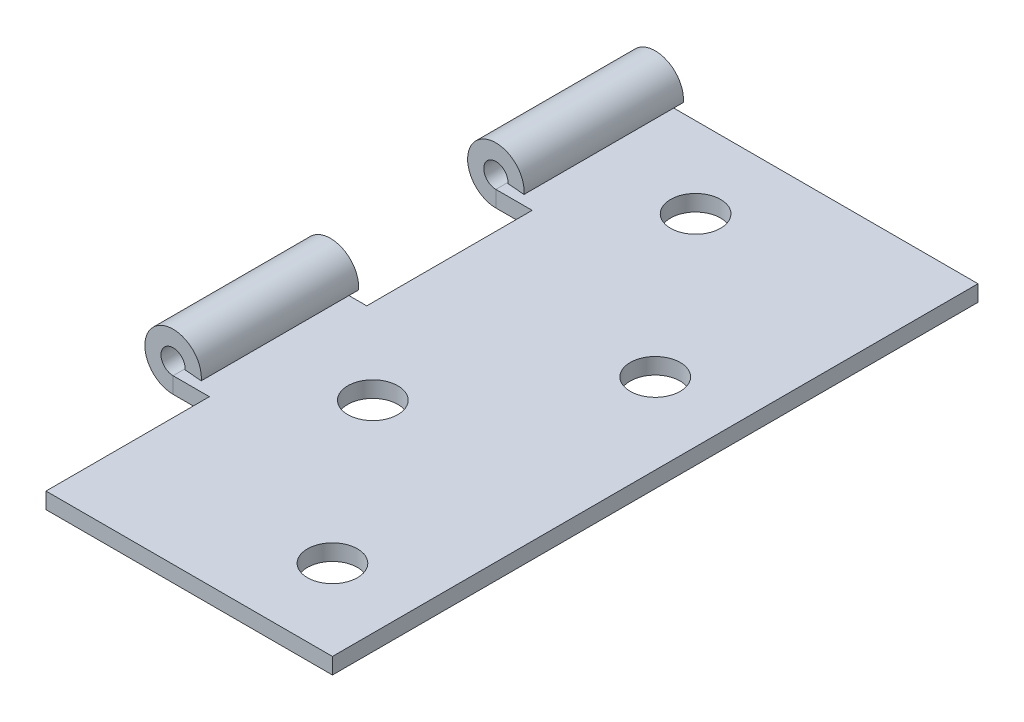
ISO-10303-21;
HEADER;
FILE_DESCRIPTION(('STEP AP214'),'2;1');
FILE_NAME('part.step','',(''),(''),'','','');
FILE_SCHEMA(('AUTOMOTIVE_DESIGN { 1 0 10303 214 1 1 1 1 }'));
ENDSEC;
DATA;
#1=APPLICATION_CONTEXT('core data for automotive mechanical design processes');
#2=APPLICATION_PROTOCOL_DEFINITION('international standard','automotive_design',2000,#1);
#3=PRODUCT_CONTEXT('',#1,'mechanical');
#4=PRODUCT('Part','Part','',(#3));
#5=PRODUCT_RELATED_PRODUCT_CATEGORY('part','',(#4));
#6=PRODUCT_DEFINITION_FORMATION('','',#4);
#7=PRODUCT_DEFINITION_CONTEXT('part definition',#1,'design');
#8=PRODUCT_DEFINITION('design','',#6,#7);
#9=PRODUCT_DEFINITION_SHAPE('','',#8);
#10=(LENGTH_UNIT() NAMED_UNIT(*) SI_UNIT(.MILLI.,.METRE.));
#11=(NAMED_UNIT(*) PLANE_ANGLE_UNIT() SI_UNIT($,.RADIAN.));
#12=(NAMED_UNIT(*) SI_UNIT($,.STERADIAN.) SOLID_ANGLE_UNIT());
#13=UNCERTAINTY_MEASURE_WITH_UNIT(LENGTH_MEASURE(1.E-05),#10,'distance_accuracy_value','');
#14=(GEOMETRIC_REPRESENTATION_CONTEXT(3) GLOBAL_UNCERTAINTY_ASSIGNED_CONTEXT((#13)) GLOBAL_UNIT_ASSIGNED_CONTEXT((#10,
#11,#12)) REPRESENTATION_CONTEXT('',''));
#15=CARTESIAN_POINT('',(0.,0.,0.));
#16=DIRECTION('',(0.,0.,1.));
#17=DIRECTION('',(1.,0.,0.));
#18=AXIS2_PLACEMENT_3D('',#15,#16,#17);
#19=CARTESIAN_POINT('',(-20.,-1.,40.));
#20=DIRECTION('',(0.,1.,0.));
#21=DIRECTION('',(0.,0.,1.));
#22=AXIS2_PLACEMENT_3D('',#19,#20,#21);
#23=PLANE('',#22);
#24=CARTESIAN_POINT('',(10.,-0.999999999999998,30.));
#25=DIRECTION('',(0.,1.,0.));
#26=DIRECTION('',(0.,0.,1.));
#27=AXIS2_PLACEMENT_3D('',#24,#25,#26);
#28=CIRCLE('',#27,3.1);
#29=CARTESIAN_POINT('',(10.,-0.999999999999998,33.1));
#30=VERTEX_POINT('',#29);
#31=EDGE_CURVE('E329',#30,#30,#28,.T.);
#32=ORIENTED_EDGE('',*,*,#31,.T.);
#33=EDGE_LOOP('',(#32));
#34=FACE_BOUND('',#33,.T.);
#35=CARTESIAN_POINT('',(-5.,-0.999999999999998,10.));
#36=DIRECTION('',(0.,1.,0.));
#37=DIRECTION('',(0.,0.,1.));
#38=AXIS2_PLACEMENT_3D('',#35,#36,#37);
#39=CIRCLE('',#38,3.1);
#40=CARTESIAN_POINT('',(-5.,-0.999999999999998,13.1));
#41=VERTEX_POINT('',#40);
#42=EDGE_CURVE('E321',#41,#41,#39,.T.);
#43=ORIENTED_EDGE('',*,*,#42,.T.);
#44=EDGE_LOOP('',(#43));
#45=FACE_BOUND('',#44,.T.);
#46=CARTESIAN_POINT('',(10.,-0.999999999999998,-10.));
#47=DIRECTION('',(0.,1.,0.));
#48=DIRECTION('',(0.,0.,1.));
#49=AXIS2_PLACEMENT_3D('',#46,#47,#48);
#50=CIRCLE('',#49,3.1);
#51=CARTESIAN_POINT('',(10.,-0.999999999999998,-6.9));
#52=VERTEX_POINT('',#51);
#53=EDGE_CURVE('E313',#52,#52,#50,.T.);
#54=ORIENTED_EDGE('',*,*,#53,.T.);
#55=EDGE_LOOP('',(#54));
#56=FACE_BOUND('',#55,.T.);
#57=CARTESIAN_POINT('',(-5.,-0.999999999999998,-30.));
#58=DIRECTION('',(0.,1.,0.));
#59=DIRECTION('',(0.,0.,1.));
#60=AXIS2_PLACEMENT_3D('',#57,#58,#59);
#61=CIRCLE('',#60,3.1);
#62=CARTESIAN_POINT('',(-5.,-0.999999999999998,-26.9));
#63=VERTEX_POINT('',#62);
#64=EDGE_CURVE('E275',#63,#63,#61,.T.);
#65=ORIENTED_EDGE('',*,*,#64,.T.);
#66=EDGE_LOOP('',(#65));
#67=FACE_BOUND('',#66,.T.);
#68=DIRECTION('',(0.,0.,-1.));
#69=VECTOR('',#68,1.);
#70=CARTESIAN_POINT('',(-15.5,-1.,-20.25));
#71=LINE('',#70,#69);
#72=CARTESIAN_POINT('',(-15.5,-1.,0.250000000000018));
#73=VERTEX_POINT('',#72);
#74=CARTESIAN_POINT('',(-15.5,-1.,-20.25));
#75=VERTEX_POINT('',#74);
#76=EDGE_CURVE('E300',#73,#75,#71,.T.);
#77=ORIENTED_EDGE('',*,*,#76,.T.);
#78=DIRECTION('',(-1.,0.,0.));
#79=VECTOR('',#78,1.);
#80=CARTESIAN_POINT('',(-20.,-1.,-20.25));
#81=LINE('',#80,#79);
#82=CARTESIAN_POINT('',(-20.,-1.,-20.25));
#83=VERTEX_POINT('',#82);
#84=EDGE_CURVE('E187',#75,#83,#81,.T.);
#85=ORIENTED_EDGE('',*,*,#84,.T.);
#86=DIRECTION('',(0.,0.,1.));
#87=VECTOR('',#86,1.);
#88=CARTESIAN_POINT('',(-20.,-0.999999999999993,-20.25));
#89=LINE('',#88,#87);
#90=CARTESIAN_POINT('',(-20.,-0.999999999999996,-40.));
#91=VERTEX_POINT('',#90);
#92=EDGE_CURVE('E184',#83,#91,#89,.F.);
#93=ORIENTED_EDGE('',*,*,#92,.T.);
#94=DIRECTION('',(1.,0.,0.));
#95=VECTOR('',#94,1.);
#96=CARTESIAN_POINT('',(-20.,-1.,-40.));
#97=LINE('',#96,#95);
#98=CARTESIAN_POINT('',(20.,-1.,-40.));
#99=VERTEX_POINT('',#98);
#100=EDGE_CURVE('E119',#91,#99,#97,.T.);
#101=ORIENTED_EDGE('',*,*,#100,.T.);
#102=DIRECTION('',(0.,0.,-1.));
#103=VECTOR('',#102,1.);
#104=CARTESIAN_POINT('',(20.,-1.,40.));
#105=LINE('',#104,#103);
#106=CARTESIAN_POINT('',(20.,-1.,40.));
#107=VERTEX_POINT('',#106);
#108=EDGE_CURVE('E11',#107,#99,#105,.T.);
#109=ORIENTED_EDGE('',*,*,#108,.F.);
#110=DIRECTION('',(1.,0.,0.));
#111=VECTOR('',#110,1.);
#112=CARTESIAN_POINT('',(-20.,-1.,40.));
#113=LINE('',#112,#111);
#114=CARTESIAN_POINT('',(-15.5,-1.,40.));
#115=VERTEX_POINT('',#114);
#116=EDGE_CURVE('E149',#115,#107,#113,.T.);
#117=ORIENTED_EDGE('',*,*,#116,.F.);
#118=DIRECTION('',(0.,0.,-1.));
#119=VECTOR('',#118,1.);
#120=CARTESIAN_POINT('',(-15.5,-1.,40.));
#121=LINE('',#120,#119);
#122=CARTESIAN_POINT('',(-15.5,-1.,19.75));
#123=VERTEX_POINT('',#122);
#124=EDGE_CURVE('E253',#115,#123,#121,.T.);
#125=ORIENTED_EDGE('',*,*,#124,.T.);
#126=DIRECTION('',(-1.,0.,0.));
#127=VECTOR('',#126,1.);
#128=CARTESIAN_POINT('',(-20.,-1.,19.75));
#129=LINE('',#128,#127);
#130=CARTESIAN_POINT('',(-20.,-1.,19.75));
#131=VERTEX_POINT('',#130);
#132=EDGE_CURVE('E258',#123,#131,#129,.T.);
#133=ORIENTED_EDGE('',*,*,#132,.T.);
#134=DIRECTION('',(0.,0.,1.));
#135=VECTOR('',#134,1.);
#136=CARTESIAN_POINT('',(-20.,-0.999999999999991,19.75));
#137=LINE('',#136,#135);
#138=CARTESIAN_POINT('',(-20.,-0.999999999999991,0.250000000000018));
#139=VERTEX_POINT('',#138);
#140=EDGE_CURVE('E243',#131,#139,#137,.F.);
#141=ORIENTED_EDGE('',*,*,#140,.T.);
#142=DIRECTION('',(1.,0.,0.));
#143=VECTOR('',#142,1.);
#144=CARTESIAN_POINT('',(-20.,-1.,0.250000000000017));
#145=LINE('',#144,#143);
#146=EDGE_CURVE('E290',#139,#73,#145,.T.);
#147=ORIENTED_EDGE('',*,*,#146,.T.);
#148=EDGE_LOOP('',(#77,#85,#93,#101,#109,#117,#125,#133,#141,#147));
#149=FACE_BOUND('',#148,.T.);
#150=ADVANCED_FACE('F49',(#34,#45,#56,#67,#149),#23,.F.);
#151=CARTESIAN_POINT('',(20.,1.,40.));
#152=DIRECTION('',(1.,0.,0.));
#153=DIRECTION('',(0.,0.,-1.));
#154=AXIS2_PLACEMENT_3D('',#151,#152,#153);
#155=PLANE('',#154);
#156=DIRECTION('',(0.,-1.,0.));
#157=VECTOR('',#156,1.);
#158=CARTESIAN_POINT('',(20.,1.,-40.));
#159=LINE('',#158,#157);
#160=CARTESIAN_POINT('',(20.,1.,-40.));
#161=VERTEX_POINT('',#160);
#162=EDGE_CURVE('E159',#161,#99,#159,.T.);
#163=ORIENTED_EDGE('',*,*,#162,.F.);
#164=DIRECTION('',(0.,0.,-1.));
#165=VECTOR('',#164,1.);
#166=CARTESIAN_POINT('',(20.,1.,40.));
#167=LINE('',#166,#165);
#168=CARTESIAN_POINT('',(20.,1.,40.));
#169=VERTEX_POINT('',#168);
#170=EDGE_CURVE('E58',#169,#161,#167,.T.);
#171=ORIENTED_EDGE('',*,*,#170,.F.);
#172=DIRECTION('',(0.,-1.,0.));
#173=VECTOR('',#172,1.);
#174=CARTESIAN_POINT('',(20.,1.,40.));
#175=LINE('',#174,#173);
#176=EDGE_CURVE('E152',#169,#107,#175,.T.);
#177=ORIENTED_EDGE('',*,*,#176,.T.);
#178=ORIENTED_EDGE('',*,*,#108,.T.);
#179=EDGE_LOOP('',(#163,#171,#177,#178));
#180=FACE_BOUND('',#179,.T.);
#181=ADVANCED_FACE('F174',(#180),#155,.T.);
#182=CARTESIAN_POINT('',(-20.,1.,40.));
#183=DIRECTION('',(0.,1.,0.));
#184=DIRECTION('',(0.,0.,1.));
#185=AXIS2_PLACEMENT_3D('',#182,#183,#184);
#186=PLANE('',#185);
#187=CARTESIAN_POINT('',(10.,1.,30.));
#188=DIRECTION('',(0.,1.,0.));
#189=DIRECTION('',(0.,0.,1.));
#190=AXIS2_PLACEMENT_3D('',#187,#188,#189);
#191=CIRCLE('',#190,3.09999999999999);
#192=CARTESIAN_POINT('',(10.,1.,33.1));
#193=VERTEX_POINT('',#192);
#194=EDGE_CURVE('E333',#193,#193,#191,.T.);
#195=ORIENTED_EDGE('',*,*,#194,.F.);
#196=EDGE_LOOP('',(#195));
#197=FACE_BOUND('',#196,.T.);
#198=CARTESIAN_POINT('',(-5.,1.,10.));
#199=DIRECTION('',(0.,1.,0.));
#200=DIRECTION('',(0.,0.,1.));
#201=AXIS2_PLACEMENT_3D('',#198,#199,#200);
#202=CIRCLE('',#201,3.09999999999999);
#203=CARTESIAN_POINT('',(-5.,1.,13.1));
#204=VERTEX_POINT('',#203);
#205=EDGE_CURVE('E325',#204,#204,#202,.T.);
#206=ORIENTED_EDGE('',*,*,#205,.F.);
#207=EDGE_LOOP('',(#206));
#208=FACE_BOUND('',#207,.T.);
#209=CARTESIAN_POINT('',(10.,1.,-10.));
#210=DIRECTION('',(0.,1.,0.));
#211=DIRECTION('',(0.,0.,1.));
#212=AXIS2_PLACEMENT_3D('',#209,#210,#211);
#213=CIRCLE('',#212,3.09999999999999);
#214=CARTESIAN_POINT('',(10.,1.,-6.90000000000001));
#215=VERTEX_POINT('',#214);
#216=EDGE_CURVE('E317',#215,#215,#213,.T.);
#217=ORIENTED_EDGE('',*,*,#216,.F.);
#218=EDGE_LOOP('',(#217));
#219=FACE_BOUND('',#218,.T.);
#220=CARTESIAN_POINT('',(-5.,1.,-30.));
#221=DIRECTION('',(0.,1.,0.));
#222=DIRECTION('',(0.,0.,1.));
#223=AXIS2_PLACEMENT_3D('',#220,#221,#222);
#224=CIRCLE('',#223,3.09999999999999);
#225=CARTESIAN_POINT('',(-5.,1.,-26.9));
#226=VERTEX_POINT('',#225);
#227=EDGE_CURVE('E309',#226,#226,#224,.T.);
#228=ORIENTED_EDGE('',*,*,#227,.F.);
#229=EDGE_LOOP('',(#228));
#230=FACE_BOUND('',#229,.T.);
#231=DIRECTION('',(-1.,0.,0.));
#232=VECTOR('',#231,1.);
#233=CARTESIAN_POINT('',(-20.,1.,-20.25));
#234=LINE('',#233,#232);
#235=CARTESIAN_POINT('',(-15.5,1.,-20.25));
#236=VERTEX_POINT('',#235);
#237=CARTESIAN_POINT('',(-20.,1.,-20.25));
#238=VERTEX_POINT('',#237);
#239=EDGE_CURVE('E286',#236,#238,#234,.T.);
#240=ORIENTED_EDGE('',*,*,#239,.F.);
#241=DIRECTION('',(0.,0.,-1.));
#242=VECTOR('',#241,1.);
#243=CARTESIAN_POINT('',(-15.5,1.,-20.25));
#244=LINE('',#243,#242);
#245=CARTESIAN_POINT('',(-15.5,1.,0.250000000000018));
#246=VERTEX_POINT('',#245);
#247=EDGE_CURVE('E291',#246,#236,#244,.T.);
#248=ORIENTED_EDGE('',*,*,#247,.F.);
#249=DIRECTION('',(1.,0.,0.));
#250=VECTOR('',#249,1.);
#251=CARTESIAN_POINT('',(-20.,1.,0.250000000000017));
#252=LINE('',#251,#250);
#253=CARTESIAN_POINT('',(-20.,1.,0.250000000000017));
#254=VERTEX_POINT('',#253);
#255=EDGE_CURVE('E267',#254,#246,#252,.T.);
#256=ORIENTED_EDGE('',*,*,#255,.F.);
#257=DIRECTION('',(0.,0.,1.));
#258=VECTOR('',#257,1.);
#259=CARTESIAN_POINT('',(-20.,1.00000000000001,19.75));
#260=LINE('',#259,#258);
#261=CARTESIAN_POINT('',(-20.,1.00000000000001,19.75));
#262=VERTEX_POINT('',#261);
#263=EDGE_CURVE('E230',#262,#254,#260,.F.);
#264=ORIENTED_EDGE('',*,*,#263,.F.);
#265=DIRECTION('',(-1.,0.,0.));
#266=VECTOR('',#265,1.);
#267=CARTESIAN_POINT('',(-20.,1.,19.75));
#268=LINE('',#267,#266);
#269=CARTESIAN_POINT('',(-15.5,1.,19.75));
#270=VERTEX_POINT('',#269);
#271=EDGE_CURVE('E257',#270,#262,#268,.T.);
#272=ORIENTED_EDGE('',*,*,#271,.F.);
#273=DIRECTION('',(0.,0.,-1.));
#274=VECTOR('',#273,1.);
#275=CARTESIAN_POINT('',(-15.5,1.,40.));
#276=LINE('',#275,#274);
#277=CARTESIAN_POINT('',(-15.5,1.,40.));
#278=VERTEX_POINT('',#277);
#279=EDGE_CURVE('E263',#278,#270,#276,.T.);
#280=ORIENTED_EDGE('',*,*,#279,.F.);
#281=DIRECTION('',(1.,0.,0.));
#282=VECTOR('',#281,1.);
#283=CARTESIAN_POINT('',(-20.,1.,40.));
#284=LINE('',#283,#282);
#285=EDGE_CURVE('E66',#278,#169,#284,.T.);
#286=ORIENTED_EDGE('',*,*,#285,.T.);
#287=ORIENTED_EDGE('',*,*,#170,.T.);
#288=DIRECTION('',(1.,0.,0.));
#289=VECTOR('',#288,1.);
#290=CARTESIAN_POINT('',(-20.,1.,-40.));
#291=LINE('',#290,#289);
#292=CARTESIAN_POINT('',(-20.,1.,-40.));
#293=VERTEX_POINT('',#292);
#294=EDGE_CURVE('E163',#293,#161,#291,.T.);
#295=ORIENTED_EDGE('',*,*,#294,.F.);
#296=DIRECTION('',(0.,0.,1.));
#297=VECTOR('',#296,1.);
#298=CARTESIAN_POINT('',(-20.,1.00000000000001,-20.25));
#299=LINE('',#298,#297);
#300=EDGE_CURVE('E137',#238,#293,#299,.F.);
#301=ORIENTED_EDGE('',*,*,#300,.F.);
#302=EDGE_LOOP('',(#240,#248,#256,#264,#272,#280,#286,#287,#295,#301));
#303=FACE_BOUND('',#302,.T.);
#304=ADVANCED_FACE('F172',(#197,#208,#219,#230,#303),#186,.T.);
#305=CARTESIAN_POINT('',(0.,0.,40.));
#306=DIRECTION('',(0.,0.,-1.));
#307=DIRECTION('',(-1.,0.,0.));
#308=AXIS2_PLACEMENT_3D('',#305,#306,#307);
#309=PLANE('',#308);
#310=ORIENTED_EDGE('',*,*,#285,.F.);
#311=DIRECTION('',(0.,1.,0.));
#312=VECTOR('',#311,1.);
#313=CARTESIAN_POINT('',(-15.5,-1.,40.));
#314=LINE('',#313,#312);
#315=EDGE_CURVE('E262',#115,#278,#314,.T.);
#316=ORIENTED_EDGE('',*,*,#315,.F.);
#317=ORIENTED_EDGE('',*,*,#116,.T.);
#318=ORIENTED_EDGE('',*,*,#176,.F.);
#319=EDGE_LOOP('',(#310,#316,#317,#318));
#320=FACE_BOUND('',#319,.T.);
#321=ADVANCED_FACE('F343',(#320),#309,.F.);
#322=CARTESIAN_POINT('',(0.,0.,-40.));
#323=DIRECTION('',(0.,0.,-1.));
#324=DIRECTION('',(-1.,0.,0.));
#325=AXIS2_PLACEMENT_3D('',#322,#323,#324);
#326=PLANE('',#325);
#327=ORIENTED_EDGE('',*,*,#100,.F.);
#328=DIRECTION('',(0.,1.,0.));
#329=VECTOR('',#328,1.);
#330=CARTESIAN_POINT('',(-20.,-1.,-40.));
#331=LINE('',#330,#329);
#332=EDGE_CURVE('E85',#91,#293,#331,.T.);
#333=ORIENTED_EDGE('',*,*,#332,.T.);
#334=ORIENTED_EDGE('',*,*,#294,.T.);
#335=ORIENTED_EDGE('',*,*,#162,.T.);
#336=EDGE_LOOP('',(#327,#333,#334,#335));
#337=FACE_BOUND('',#336,.T.);
#338=ADVANCED_FACE('F177',(#337),#326,.T.);
#339=CARTESIAN_POINT('',(-18.5057079528624,2.3692663858785,-30.125));
#340=DIRECTION('',(0.0871557427476686,0.996194698091745,0.));
#341=DIRECTION('',(0.,0.,1.));
#342=AXIS2_PLACEMENT_3D('',#339,#340,#341);
#343=PLANE('',#342);
#344=DIRECTION('',(0.996194698091745,-0.0871557427476686,0.));
#345=VECTOR('',#344,1.);
#346=CARTESIAN_POINT('',(-18.5057079528624,2.3692663858785,-20.25));
#347=LINE('',#346,#345);
#348=CARTESIAN_POINT('',(-18.5057079528624,2.3692663858785,-20.25));
#349=VERTEX_POINT('',#348);
#350=CARTESIAN_POINT('',(-16.5133185566789,2.19495490038316,-20.25));
#351=VERTEX_POINT('',#350);
#352=EDGE_CURVE('E107',#349,#351,#347,.T.);
#353=ORIENTED_EDGE('',*,*,#352,.F.);
#354=DIRECTION('',(0.,0.,1.));
#355=VECTOR('',#354,1.);
#356=CARTESIAN_POINT('',(-18.5057079528624,2.3692663858785,-20.25));
#357=LINE('',#356,#355);
#358=CARTESIAN_POINT('',(-18.5057079528624,2.3692663858785,-40.));
#359=VERTEX_POINT('',#358);
#360=EDGE_CURVE('E110',#359,#349,#357,.T.);
#361=ORIENTED_EDGE('',*,*,#360,.F.);
#362=DIRECTION('',(0.996194698091745,-0.0871557427476687,0.));
#363=VECTOR('',#362,1.);
#364=CARTESIAN_POINT('',(-18.5057079528624,2.3692663858785,-40.));
#365=LINE('',#364,#363);
#366=CARTESIAN_POINT('',(-16.5133185566789,2.19495490038316,-40.));
#367=VERTEX_POINT('',#366);
#368=EDGE_CURVE('E120',#359,#367,#365,.T.);
#369=ORIENTED_EDGE('',*,*,#368,.T.);
#370=DIRECTION('',(0.,0.,1.));
#371=VECTOR('',#370,1.);
#372=CARTESIAN_POINT('',(-16.5133185566789,2.19495490038316,-20.25));
#373=LINE('',#372,#371);
#374=EDGE_CURVE('E113',#367,#351,#373,.T.);
#375=ORIENTED_EDGE('',*,*,#374,.T.);
#376=EDGE_LOOP('',(#353,#361,#369,#375));
#377=FACE_BOUND('',#376,.T.);
#378=ADVANCED_FACE('F109',(#377),#343,.F.);
#379=CARTESIAN_POINT('',(-20.,2.5,-40.));
#380=DIRECTION('',(0.,0.,-1.));
#381=DIRECTION('',(0.,1.,0.));
#382=AXIS2_PLACEMENT_3D('',#379,#380,#381);
#383=PLANE('',#382);
#384=ORIENTED_EDGE('',*,*,#368,.F.);
#385=CARTESIAN_POINT('',(-20.,2.5,-40.));
#386=DIRECTION('',(0.,0.,1.));
#387=DIRECTION('',(0.,-1.,0.));
#388=AXIS2_PLACEMENT_3D('',#385,#386,#387);
#389=CIRCLE('',#388,1.49999999999999);
#390=EDGE_CURVE('E128',#293,#359,#389,.F.);
#391=ORIENTED_EDGE('',*,*,#390,.F.);
#392=ORIENTED_EDGE('',*,*,#332,.F.);
#393=CARTESIAN_POINT('',(-20.,2.5,-40.));
#394=DIRECTION('',(0.,0.,1.));
#395=DIRECTION('',(0.,-1.,0.));
#396=AXIS2_PLACEMENT_3D('',#393,#394,#395);
#397=CIRCLE('',#396,3.49999999999999);
#398=EDGE_CURVE('E148',#91,#367,#397,.F.);
#399=ORIENTED_EDGE('',*,*,#398,.T.);
#400=EDGE_LOOP('',(#384,#391,#392,#399));
#401=FACE_BOUND('',#400,.T.);
#402=ADVANCED_FACE('F541',(#401),#383,.T.);
#403=CARTESIAN_POINT('',(-20.,2.5,-20.25));
#404=DIRECTION('',(0.,0.,-1.));
#405=DIRECTION('',(0.,1.,0.));
#406=AXIS2_PLACEMENT_3D('',#403,#404,#405);
#407=PLANE('',#406);
#408=CARTESIAN_POINT('',(-20.,2.5,-20.25));
#409=DIRECTION('',(0.,0.,1.));
#410=DIRECTION('',(0.,-1.,0.));
#411=AXIS2_PLACEMENT_3D('',#408,#409,#410);
#412=CIRCLE('',#411,1.49999999999999);
#413=EDGE_CURVE('E126',#349,#238,#412,.T.);
#414=ORIENTED_EDGE('',*,*,#413,.F.);
#415=ORIENTED_EDGE('',*,*,#352,.T.);
#416=CARTESIAN_POINT('',(-20.,2.5,-20.25));
#417=DIRECTION('',(0.,0.,1.));
#418=DIRECTION('',(0.,-1.,0.));
#419=AXIS2_PLACEMENT_3D('',#416,#417,#418);
#420=CIRCLE('',#419,3.49999999999999);
#421=EDGE_CURVE('E190',#351,#83,#420,.T.);
#422=ORIENTED_EDGE('',*,*,#421,.T.);
#423=DIRECTION('',(0.,-1.,0.));
#424=VECTOR('',#423,1.);
#425=CARTESIAN_POINT('',(-20.,1.00000000000001,-20.25));
#426=LINE('',#425,#424);
#427=EDGE_CURVE('E135',#238,#83,#426,.T.);
#428=ORIENTED_EDGE('',*,*,#427,.F.);
#429=EDGE_LOOP('',(#414,#415,#422,#428));
#430=FACE_BOUND('',#429,.T.);
#431=ADVANCED_FACE('F133',(#430),#407,.F.);
#432=CARTESIAN_POINT('',(-20.,2.5,-20.25));
#433=DIRECTION('',(0.,0.,1.));
#434=DIRECTION('',(0.996194698091745,-0.0871557427476687,0.));
#435=AXIS2_PLACEMENT_3D('',#432,#433,#434);
#436=CYLINDRICAL_SURFACE('',#435,3.49999999999999);
#437=ORIENTED_EDGE('',*,*,#92,.F.);
#438=ORIENTED_EDGE('',*,*,#421,.F.);
#439=ORIENTED_EDGE('',*,*,#374,.F.);
#440=ORIENTED_EDGE('',*,*,#398,.F.);
#441=EDGE_LOOP('',(#437,#438,#439,#440));
#442=FACE_BOUND('',#441,.T.);
#443=ADVANCED_FACE('F522',(#442),#436,.T.);
#444=CARTESIAN_POINT('',(-20.,2.5,-20.25));
#445=DIRECTION('',(0.,0.,1.));
#446=DIRECTION('',(0.996194698091745,-0.0871557427476687,0.));
#447=AXIS2_PLACEMENT_3D('',#444,#445,#446);
#448=CYLINDRICAL_SURFACE('',#447,1.49999999999999);
#449=ORIENTED_EDGE('',*,*,#300,.T.);
#450=ORIENTED_EDGE('',*,*,#390,.T.);
#451=ORIENTED_EDGE('',*,*,#360,.T.);
#452=ORIENTED_EDGE('',*,*,#413,.T.);
#453=EDGE_LOOP('',(#449,#450,#451,#452));
#454=FACE_BOUND('',#453,.T.);
#455=ADVANCED_FACE('F124',(#454),#448,.F.);
#456=CARTESIAN_POINT('',(-18.5057079528624,2.3692663858785,10.));
#457=DIRECTION('',(0.0871557427476687,0.996194698091744,0.));
#458=DIRECTION('',(0.,0.,1.));
#459=AXIS2_PLACEMENT_3D('',#456,#457,#458);
#460=PLANE('',#459);
#461=DIRECTION('',(0.996194698091745,-0.0871557427476687,0.));
#462=VECTOR('',#461,1.);
#463=CARTESIAN_POINT('',(-18.5057079528624,2.3692663858785,19.75));
#464=LINE('',#463,#462);
#465=CARTESIAN_POINT('',(-18.5057079528624,2.3692663858785,19.75));
#466=VERTEX_POINT('',#465);
#467=CARTESIAN_POINT('',(-16.5133185566789,2.19495490038317,19.75));
#468=VERTEX_POINT('',#467);
#469=EDGE_CURVE('E130',#466,#468,#464,.T.);
#470=ORIENTED_EDGE('',*,*,#469,.F.);
#471=DIRECTION('',(0.,0.,1.));
#472=VECTOR('',#471,1.);
#473=CARTESIAN_POINT('',(-18.5057079528624,2.3692663858785,19.75));
#474=LINE('',#473,#472);
#475=CARTESIAN_POINT('',(-18.5057079528624,2.3692663858785,0.250000000000011));
#476=VERTEX_POINT('',#475);
#477=EDGE_CURVE('E221',#476,#466,#474,.T.);
#478=ORIENTED_EDGE('',*,*,#477,.F.);
#479=DIRECTION('',(0.996194698091745,-0.0871557427476687,0.));
#480=VECTOR('',#479,1.);
#481=CARTESIAN_POINT('',(-18.5057079528624,2.3692663858785,0.250000000000011));
#482=LINE('',#481,#480);
#483=CARTESIAN_POINT('',(-16.5133185566789,2.19495490038317,0.250000000000018));
#484=VERTEX_POINT('',#483);
#485=EDGE_CURVE('E214',#476,#484,#482,.T.);
#486=ORIENTED_EDGE('',*,*,#485,.T.);
#487=DIRECTION('',(0.,0.,1.));
#488=VECTOR('',#487,1.);
#489=CARTESIAN_POINT('',(-16.5133185566789,2.19495490038317,19.75));
#490=LINE('',#489,#488);
#491=EDGE_CURVE('E238',#484,#468,#490,.T.);
#492=ORIENTED_EDGE('',*,*,#491,.T.);
#493=EDGE_LOOP('',(#470,#478,#486,#492));
#494=FACE_BOUND('',#493,.T.);
#495=ADVANCED_FACE('F499',(#494),#460,.F.);
#496=CARTESIAN_POINT('',(-20.,2.50000000000001,0.250000000000007));
#497=DIRECTION('',(0.,0.,-1.));
#498=DIRECTION('',(-1.,0.,0.));
#499=AXIS2_PLACEMENT_3D('',#496,#497,#498);
#500=PLANE('',#499);
#501=ORIENTED_EDGE('',*,*,#485,.F.);
#502=CARTESIAN_POINT('',(-20.,2.50000000000001,0.250000000000007));
#503=DIRECTION('',(0.,0.,1.));
#504=DIRECTION('',(1.,0.,0.));
#505=AXIS2_PLACEMENT_3D('',#502,#503,#504);
#506=CIRCLE('',#505,1.5);
#507=EDGE_CURVE('E234',#254,#476,#506,.F.);
#508=ORIENTED_EDGE('',*,*,#507,.F.);
#509=DIRECTION('',(0.,-1.,0.));
#510=VECTOR('',#509,1.);
#511=CARTESIAN_POINT('',(-20.,1.00000000000001,0.250000000000011));
#512=LINE('',#511,#510);
#513=EDGE_CURVE('E209',#254,#139,#512,.T.);
#514=ORIENTED_EDGE('',*,*,#513,.T.);
#515=CARTESIAN_POINT('',(-20.,2.50000000000001,0.250000000000018));
#516=DIRECTION('',(0.,0.,1.));
#517=DIRECTION('',(1.,0.,0.));
#518=AXIS2_PLACEMENT_3D('',#515,#516,#517);
#519=CIRCLE('',#518,3.5);
#520=EDGE_CURVE('E210',#139,#484,#519,.F.);
#521=ORIENTED_EDGE('',*,*,#520,.T.);
#522=EDGE_LOOP('',(#501,#508,#514,#521));
#523=FACE_BOUND('',#522,.T.);
#524=ADVANCED_FACE('F488',(#523),#500,.T.);
#525=CARTESIAN_POINT('',(-20.,2.50000000000001,19.75));
#526=DIRECTION('',(0.,0.,-1.));
#527=DIRECTION('',(-1.,0.,0.));
#528=AXIS2_PLACEMENT_3D('',#525,#526,#527);
#529=PLANE('',#528);
#530=CARTESIAN_POINT('',(-20.,2.50000000000001,19.75));
#531=DIRECTION('',(0.,0.,1.));
#532=DIRECTION('',(1.,0.,0.));
#533=AXIS2_PLACEMENT_3D('',#530,#531,#532);
#534=CIRCLE('',#533,1.5);
#535=EDGE_CURVE('E225',#466,#262,#534,.T.);
#536=ORIENTED_EDGE('',*,*,#535,.F.);
#537=ORIENTED_EDGE('',*,*,#469,.T.);
#538=CARTESIAN_POINT('',(-20.,2.50000000000001,19.75));
#539=DIRECTION('',(0.,0.,1.));
#540=DIRECTION('',(1.,0.,0.));
#541=AXIS2_PLACEMENT_3D('',#538,#539,#540);
#542=CIRCLE('',#541,3.5);
#543=EDGE_CURVE('E239',#468,#131,#542,.T.);
#544=ORIENTED_EDGE('',*,*,#543,.T.);
#545=DIRECTION('',(0.,-1.,0.));
#546=VECTOR('',#545,1.);
#547=CARTESIAN_POINT('',(-20.,1.00000000000001,19.75));
#548=LINE('',#547,#546);
#549=EDGE_CURVE('E198',#262,#131,#548,.T.);
#550=ORIENTED_EDGE('',*,*,#549,.F.);
#551=EDGE_LOOP('',(#536,#537,#544,#550));
#552=FACE_BOUND('',#551,.T.);
#553=ADVANCED_FACE('F477',(#552),#529,.F.);
#554=CARTESIAN_POINT('',(-20.,2.50000000000001,19.75));
#555=DIRECTION('',(0.,0.,1.));
#556=DIRECTION('',(0.996194698091745,-0.0871557427476688,0.));
#557=AXIS2_PLACEMENT_3D('',#554,#555,#556);
#558=CYLINDRICAL_SURFACE('',#557,3.5);
#559=ORIENTED_EDGE('',*,*,#140,.F.);
#560=ORIENTED_EDGE('',*,*,#543,.F.);
#561=ORIENTED_EDGE('',*,*,#491,.F.);
#562=ORIENTED_EDGE('',*,*,#520,.F.);
#563=EDGE_LOOP('',(#559,#560,#561,#562));
#564=FACE_BOUND('',#563,.T.);
#565=ADVANCED_FACE('F466',(#564),#558,.T.);
#566=CARTESIAN_POINT('',(-20.,2.50000000000001,19.75));
#567=DIRECTION('',(0.,0.,1.));
#568=DIRECTION('',(0.996194698091745,-0.0871557427476688,0.));
#569=AXIS2_PLACEMENT_3D('',#566,#567,#568);
#570=CYLINDRICAL_SURFACE('',#569,1.5);
#571=ORIENTED_EDGE('',*,*,#263,.T.);
#572=ORIENTED_EDGE('',*,*,#507,.T.);
#573=ORIENTED_EDGE('',*,*,#477,.T.);
#574=ORIENTED_EDGE('',*,*,#535,.T.);
#575=EDGE_LOOP('',(#571,#572,#573,#574));
#576=FACE_BOUND('',#575,.T.);
#577=ADVANCED_FACE('F455',(#576),#570,.F.);
#578=CARTESIAN_POINT('',(-20.,-1.,19.75));
#579=DIRECTION('',(0.,0.,-1.));
#580=DIRECTION('',(-1.,0.,0.));
#581=AXIS2_PLACEMENT_3D('',#578,#579,#580);
#582=PLANE('',#581);
#583=ORIENTED_EDGE('',*,*,#271,.T.);
#584=ORIENTED_EDGE('',*,*,#549,.T.);
#585=ORIENTED_EDGE('',*,*,#132,.F.);
#586=DIRECTION('',(0.,1.,0.));
#587=VECTOR('',#586,1.);
#588=CARTESIAN_POINT('',(-15.5,-1.,19.75));
#589=LINE('',#588,#587);
#590=EDGE_CURVE('E271',#123,#270,#589,.T.);
#591=ORIENTED_EDGE('',*,*,#590,.T.);
#592=EDGE_LOOP('',(#583,#584,#585,#591));
#593=FACE_BOUND('',#592,.T.);
#594=ADVANCED_FACE('F444',(#593),#582,.F.);
#595=CARTESIAN_POINT('',(-15.5,-1.,40.));
#596=DIRECTION('',(1.,0.,0.));
#597=DIRECTION('',(0.,0.,-1.));
#598=AXIS2_PLACEMENT_3D('',#595,#596,#597);
#599=PLANE('',#598);
#600=ORIENTED_EDGE('',*,*,#279,.T.);
#601=ORIENTED_EDGE('',*,*,#590,.F.);
#602=ORIENTED_EDGE('',*,*,#124,.F.);
#603=ORIENTED_EDGE('',*,*,#315,.T.);
#604=EDGE_LOOP('',(#600,#601,#602,#603));
#605=FACE_BOUND('',#604,.T.);
#606=ADVANCED_FACE('F434',(#605),#599,.F.);
#607=CARTESIAN_POINT('',(-20.,-1.,-20.25));
#608=DIRECTION('',(0.,0.,-1.));
#609=DIRECTION('',(-1.,0.,0.));
#610=AXIS2_PLACEMENT_3D('',#607,#608,#609);
#611=PLANE('',#610);
#612=ORIENTED_EDGE('',*,*,#239,.T.);
#613=ORIENTED_EDGE('',*,*,#427,.T.);
#614=ORIENTED_EDGE('',*,*,#84,.F.);
#615=DIRECTION('',(0.,1.,0.));
#616=VECTOR('',#615,1.);
#617=CARTESIAN_POINT('',(-15.5,-1.,-20.25));
#618=LINE('',#617,#616);
#619=EDGE_CURVE('E226',#75,#236,#618,.T.);
#620=ORIENTED_EDGE('',*,*,#619,.T.);
#621=EDGE_LOOP('',(#612,#613,#614,#620));
#622=FACE_BOUND('',#621,.T.);
#623=ADVANCED_FACE('F423',(#622),#611,.F.);
#624=CARTESIAN_POINT('',(-15.5,-1.,-20.25));
#625=DIRECTION('',(1.,0.,0.));
#626=DIRECTION('',(0.,0.,-1.));
#627=AXIS2_PLACEMENT_3D('',#624,#625,#626);
#628=PLANE('',#627);
#629=ORIENTED_EDGE('',*,*,#247,.T.);
#630=ORIENTED_EDGE('',*,*,#619,.F.);
#631=ORIENTED_EDGE('',*,*,#76,.F.);
#632=DIRECTION('',(0.,1.,0.));
#633=VECTOR('',#632,1.);
#634=CARTESIAN_POINT('',(-15.5,-1.,0.250000000000018));
#635=LINE('',#634,#633);
#636=EDGE_CURVE('E279',#73,#246,#635,.T.);
#637=ORIENTED_EDGE('',*,*,#636,.T.);
#638=EDGE_LOOP('',(#629,#630,#631,#637));
#639=FACE_BOUND('',#638,.T.);
#640=ADVANCED_FACE('F364',(#639),#628,.F.);
#641=CARTESIAN_POINT('',(-20.,-1.,0.250000000000017));
#642=DIRECTION('',(0.,0.,1.));
#643=DIRECTION('',(1.,0.,0.));
#644=AXIS2_PLACEMENT_3D('',#641,#642,#643);
#645=PLANE('',#644);
#646=ORIENTED_EDGE('',*,*,#255,.T.);
#647=ORIENTED_EDGE('',*,*,#636,.F.);
#648=ORIENTED_EDGE('',*,*,#146,.F.);
#649=ORIENTED_EDGE('',*,*,#513,.F.);
#650=EDGE_LOOP('',(#646,#647,#648,#649));
#651=FACE_BOUND('',#650,.T.);
#652=ADVANCED_FACE('F354',(#651),#645,.F.);
#653=CARTESIAN_POINT('',(-5.,1.,-30.));
#654=DIRECTION('',(0.,1.,0.));
#655=DIRECTION('',(0.,0.,1.));
#656=AXIS2_PLACEMENT_3D('',#653,#654,#655);
#657=CYLINDRICAL_SURFACE('',#656,3.09999999999999);
#658=ORIENTED_EDGE('',*,*,#64,.F.);
#659=EDGE_LOOP('',(#658));
#660=FACE_BOUND('',#659,.T.);
#661=ORIENTED_EDGE('',*,*,#227,.T.);
#662=EDGE_LOOP('',(#661));
#663=FACE_BOUND('',#662,.T.);
#664=ADVANCED_FACE('F351',(#660,#663),#657,.F.);
#665=CARTESIAN_POINT('',(10.,1.,-10.));
#666=DIRECTION('',(0.,1.,0.));
#667=DIRECTION('',(0.,0.,1.));
#668=AXIS2_PLACEMENT_3D('',#665,#666,#667);
#669=CYLINDRICAL_SURFACE('',#668,3.09999999999999);
#670=ORIENTED_EDGE('',*,*,#53,.F.);
#671=EDGE_LOOP('',(#670));
#672=FACE_BOUND('',#671,.T.);
#673=ORIENTED_EDGE('',*,*,#216,.T.);
#674=EDGE_LOOP('',(#673));
#675=FACE_BOUND('',#674,.T.);
#676=ADVANCED_FACE('F353',(#672,#675),#669,.F.);
#677=CARTESIAN_POINT('',(-5.,1.,10.));
#678=DIRECTION('',(0.,1.,0.));
#679=DIRECTION('',(0.,0.,1.));
#680=AXIS2_PLACEMENT_3D('',#677,#678,#679);
#681=CYLINDRICAL_SURFACE('',#680,3.09999999999999);
#682=ORIENTED_EDGE('',*,*,#42,.F.);
#683=EDGE_LOOP('',(#682));
#684=FACE_BOUND('',#683,.T.);
#685=ORIENTED_EDGE('',*,*,#205,.T.);
#686=EDGE_LOOP('',(#685));
#687=FACE_BOUND('',#686,.T.);
#688=ADVANCED_FACE('F360',(#684,#687),#681,.F.);
#689=CARTESIAN_POINT('',(10.,1.,30.));
#690=DIRECTION('',(0.,1.,0.));
#691=DIRECTION('',(0.,0.,1.));
#692=AXIS2_PLACEMENT_3D('',#689,#690,#691);
#693=CYLINDRICAL_SURFACE('',#692,3.09999999999999);
#694=ORIENTED_EDGE('',*,*,#31,.F.);
#695=EDGE_LOOP('',(#694));
#696=FACE_BOUND('',#695,.T.);
#697=ORIENTED_EDGE('',*,*,#194,.T.);
#698=EDGE_LOOP('',(#697));
#699=FACE_BOUND('',#698,.T.);
#700=ADVANCED_FACE('F339',(#696,#699),#693,.F.);
#701=CLOSED_SHELL('',(#150,#181,#304,#321,#338,#378,#402,#431,#443,#455,#495,#524,#553,#565,
#577,#594,#606,#623,#640,#652,#664,#676,#688,#700));
#702=MANIFOLD_SOLID_BREP('B2',#701);
#703=ADVANCED_BREP_SHAPE_REPRESENTATION('',(#18,#702),#14);
#704=SHAPE_DEFINITION_REPRESENTATION(#9,#703);
ENDSEC;
END-ISO-10303-21;
